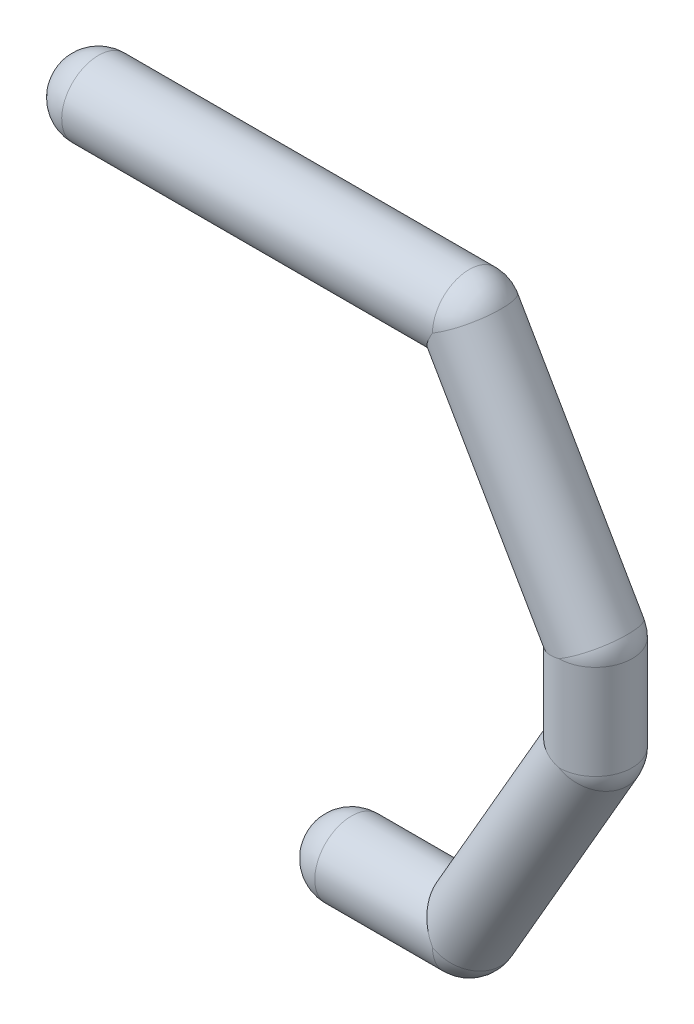
ISO-10303-21;
HEADER;
FILE_DESCRIPTION(('STEP AP214'),'2;1');
FILE_NAME('part.step','',(''),(''),'','','');
FILE_SCHEMA(('AUTOMOTIVE_DESIGN { 1 0 10303 214 1 1 1 1 }'));
ENDSEC;
DATA;
#1=APPLICATION_CONTEXT('core data for automotive mechanical design processes');
#2=APPLICATION_PROTOCOL_DEFINITION('international standard','automotive_design',2000,#1);
#3=PRODUCT_CONTEXT('',#1,'mechanical');
#4=PRODUCT('Part','Part','',(#3));
#5=PRODUCT_RELATED_PRODUCT_CATEGORY('part','',(#4));
#6=PRODUCT_DEFINITION_FORMATION('','',#4);
#7=PRODUCT_DEFINITION_CONTEXT('part definition',#1,'design');
#8=PRODUCT_DEFINITION('design','',#6,#7);
#9=PRODUCT_DEFINITION_SHAPE('','',#8);
#10=(LENGTH_UNIT() NAMED_UNIT(*) SI_UNIT(.MILLI.,.METRE.));
#11=(NAMED_UNIT(*) PLANE_ANGLE_UNIT() SI_UNIT($,.RADIAN.));
#12=(NAMED_UNIT(*) SI_UNIT($,.STERADIAN.) SOLID_ANGLE_UNIT());
#13=UNCERTAINTY_MEASURE_WITH_UNIT(LENGTH_MEASURE(1.E-05),#10,'distance_accuracy_value','');
#14=(GEOMETRIC_REPRESENTATION_CONTEXT(3) GLOBAL_UNCERTAINTY_ASSIGNED_CONTEXT((#13)) GLOBAL_UNIT_ASSIGNED_CONTEXT((#10,
#11,#12)) REPRESENTATION_CONTEXT('',''));
#15=CARTESIAN_POINT('',(0.,0.,0.));
#16=DIRECTION('',(0.,0.,1.));
#17=DIRECTION('',(1.,0.,0.));
#18=AXIS2_PLACEMENT_3D('',#15,#16,#17);
#19=CARTESIAN_POINT('',(20.396,-13.08,1.725));
#20=DIRECTION('',(1.,0.,0.));
#21=DIRECTION('',(0.,-1.,0.));
#22=AXIS2_PLACEMENT_3D('',#19,#20,#21);
#23=SPHERICAL_SURFACE('',#22,0.24);
#24=CARTESIAN_POINT('',(20.396,-13.08,1.725));
#25=DIRECTION('',(-1.,0.,0.));
#26=DIRECTION('',(0.,0.,1.));
#27=AXIS2_PLACEMENT_3D('',#24,#25,#26);
#28=CIRCLE('',#27,0.24);
#29=CARTESIAN_POINT('',(20.396,-13.08,1.965));
#30=VERTEX_POINT('',#29);
#31=EDGE_CURVE('E70',#30,#30,#28,.F.);
#32=ORIENTED_EDGE('',*,*,#31,.F.);
#33=EDGE_LOOP('',(#32));
#34=FACE_BOUND('',#33,.T.);
#35=ADVANCED_FACE('F63',(#34),#23,.T.);
#36=CARTESIAN_POINT('',(21.166,-13.08,1.725));
#37=DIRECTION('',(-1.,0.,0.));
#38=DIRECTION('',(0.,0.,1.));
#39=AXIS2_PLACEMENT_3D('',#36,#37,#38);
#40=CYLINDRICAL_SURFACE('',#39,0.24);
#41=CARTESIAN_POINT('',(21.166,-13.08,1.725));
#42=DIRECTION('',(-0.866000737383216,-0.50004272102664,0.));
#43=DIRECTION('',(-0.500042721026639,0.866000737383216,0.));
#44=AXIS2_PLACEMENT_3D('',#41,#42,#43);
#45=ELLIPSE('',#44,0.277136022684236,0.24);
#46=CARTESIAN_POINT('',(21.166,-13.08,1.485));
#47=VERTEX_POINT('',#46);
#48=CARTESIAN_POINT('',(21.166,-13.08,1.965));
#49=VERTEX_POINT('',#48);
#50=EDGE_CURVE('E12',#47,#49,#45,.F.);
#51=ORIENTED_EDGE('',*,*,#50,.F.);
#52=CARTESIAN_POINT('',(21.166,-13.08,1.725));
#53=DIRECTION('',(-1.,0.,0.));
#54=DIRECTION('',(0.,0.,1.));
#55=AXIS2_PLACEMENT_3D('',#52,#53,#54);
#56=CIRCLE('',#55,0.24);
#57=EDGE_CURVE('E77',#47,#49,#56,.T.);
#58=ORIENTED_EDGE('',*,*,#57,.T.);
#59=EDGE_LOOP('',(#51,#58));
#60=FACE_BOUND('',#59,.T.);
#61=ORIENTED_EDGE('',*,*,#31,.T.);
#62=EDGE_LOOP('',(#61));
#63=FACE_BOUND('',#62,.T.);
#64=ADVANCED_FACE('F137',(#60,#63),#40,.T.);
#65=CARTESIAN_POINT('',(21.166,-13.08,1.725));
#66=DIRECTION('',(1.,0.,0.));
#67=DIRECTION('',(0.,-1.,0.));
#68=AXIS2_PLACEMENT_3D('',#65,#66,#67);
#69=SPHERICAL_SURFACE('',#68,0.24);
#70=ORIENTED_EDGE('',*,*,#57,.F.);
#71=CARTESIAN_POINT('',(21.166,-13.08,1.725));
#72=DIRECTION('',(-0.499914554296549,-0.86607473026436,0.));
#73=DIRECTION('',(0.86607473026436,-0.499914554296549,0.));
#74=AXIS2_PLACEMENT_3D('',#71,#72,#73);
#75=CIRCLE('',#74,0.24);
#76=EDGE_CURVE('E128',#49,#47,#75,.F.);
#77=ORIENTED_EDGE('',*,*,#76,.F.);
#78=EDGE_LOOP('',(#70,#77));
#79=FACE_BOUND('',#78,.T.);
#80=ADVANCED_FACE('F143',(#79),#69,.T.);
#81=CARTESIAN_POINT('',(21.992,-11.649,1.725));
#82=DIRECTION('',(-0.499914554296549,-0.86607473026436,0.));
#83=DIRECTION('',(0.86607473026436,-0.499914554296549,0.));
#84=AXIS2_PLACEMENT_3D('',#81,#82,#83);
#85=CYLINDRICAL_SURFACE('',#84,0.24);
#86=CARTESIAN_POINT('',(21.992,-11.649,1.725));
#87=DIRECTION('',(-0.258771394995313,-0.965938592837132,0.));
#88=DIRECTION('',(-0.965938592837132,0.258771394995313,0.));
#89=AXIS2_PLACEMENT_3D('',#86,#87,#88);
#90=ELLIPSE('',#89,0.248462999387029,0.24);
#91=CARTESIAN_POINT('',(21.992,-11.649,1.485));
#92=VERTEX_POINT('',#91);
#93=CARTESIAN_POINT('',(21.992,-11.649,1.965));
#94=VERTEX_POINT('',#93);
#95=EDGE_CURVE('E131',#92,#94,#90,.F.);
#96=ORIENTED_EDGE('',*,*,#95,.F.);
#97=CARTESIAN_POINT('',(21.992,-11.649,1.725));
#98=DIRECTION('',(-0.499914554296552,-0.866074730264358,0.));
#99=DIRECTION('',(0.866074730264358,-0.499914554296552,0.));
#100=AXIS2_PLACEMENT_3D('',#97,#98,#99);
#101=CIRCLE('',#100,0.24);
#102=EDGE_CURVE('E126',#92,#94,#101,.T.);
#103=ORIENTED_EDGE('',*,*,#102,.T.);
#104=EDGE_LOOP('',(#96,#103));
#105=FACE_BOUND('',#104,.T.);
#106=ORIENTED_EDGE('',*,*,#76,.T.);
#107=ORIENTED_EDGE('',*,*,#50,.T.);
#108=EDGE_LOOP('',(#106,#107));
#109=FACE_BOUND('',#108,.T.);
#110=ADVANCED_FACE('F147',(#105,#109),#85,.T.);
#111=CARTESIAN_POINT('',(21.992,-11.649,1.725));
#112=DIRECTION('',(1.,0.,0.));
#113=DIRECTION('',(0.,-1.,0.));
#114=AXIS2_PLACEMENT_3D('',#111,#112,#113);
#115=SPHERICAL_SURFACE('',#114,0.24);
#116=ORIENTED_EDGE('',*,*,#102,.F.);
#117=CARTESIAN_POINT('',(21.992,-11.649,1.725));
#118=DIRECTION('',(0.,-1.,0.));
#119=DIRECTION('',(0.,0.,-1.));
#120=AXIS2_PLACEMENT_3D('',#117,#118,#119);
#121=CIRCLE('',#120,0.24);
#122=EDGE_CURVE('E116',#94,#92,#121,.F.);
#123=ORIENTED_EDGE('',*,*,#122,.F.);
#124=EDGE_LOOP('',(#116,#123));
#125=FACE_BOUND('',#124,.T.);
#126=ADVANCED_FACE('F153',(#125),#115,.T.);
#127=CARTESIAN_POINT('',(21.992,-11.031,1.725));
#128=DIRECTION('',(0.,-1.,0.));
#129=DIRECTION('',(0.,0.,-1.));
#130=AXIS2_PLACEMENT_3D('',#127,#128,#129);
#131=CYLINDRICAL_SURFACE('',#130,0.240000000000001);
#132=CARTESIAN_POINT('',(21.992,-11.031,1.725));
#133=DIRECTION('',(0.258771394995313,-0.965938592837133,0.));
#134=DIRECTION('',(-0.965938592837133,-0.258771394995312,0.));
#135=AXIS2_PLACEMENT_3D('',#132,#133,#134);
#136=ELLIPSE('',#135,0.248462999387029,0.24);
#137=CARTESIAN_POINT('',(21.992,-11.031,1.485));
#138=VERTEX_POINT('',#137);
#139=CARTESIAN_POINT('',(21.992,-11.031,1.965));
#140=VERTEX_POINT('',#139);
#141=EDGE_CURVE('E123',#138,#140,#136,.F.);
#142=ORIENTED_EDGE('',*,*,#141,.F.);
#143=CARTESIAN_POINT('',(21.992,-11.031,1.725));
#144=DIRECTION('',(0.,-1.,0.));
#145=DIRECTION('',(0.,0.,-1.));
#146=AXIS2_PLACEMENT_3D('',#143,#144,#145);
#147=CIRCLE('',#146,0.240000000000001);
#148=EDGE_CURVE('E114',#138,#140,#147,.T.);
#149=ORIENTED_EDGE('',*,*,#148,.T.);
#150=EDGE_LOOP('',(#142,#149));
#151=FACE_BOUND('',#150,.T.);
#152=ORIENTED_EDGE('',*,*,#122,.T.);
#153=ORIENTED_EDGE('',*,*,#95,.T.);
#154=EDGE_LOOP('',(#152,#153));
#155=FACE_BOUND('',#154,.T.);
#156=ADVANCED_FACE('F157',(#151,#155),#131,.T.);
#157=CARTESIAN_POINT('',(21.992,-11.031,1.725));
#158=DIRECTION('',(1.,0.,0.));
#159=DIRECTION('',(0.,-1.,0.));
#160=AXIS2_PLACEMENT_3D('',#157,#158,#159);
#161=SPHERICAL_SURFACE('',#160,0.24);
#162=ORIENTED_EDGE('',*,*,#148,.F.);
#163=CARTESIAN_POINT('',(21.992,-11.031,1.725));
#164=DIRECTION('',(0.499914554296548,-0.86607473026436,0.));
#165=DIRECTION('',(0.86607473026436,0.499914554296548,0.));
#166=AXIS2_PLACEMENT_3D('',#163,#164,#165);
#167=CIRCLE('',#166,0.24);
#168=EDGE_CURVE('E104',#140,#138,#167,.F.);
#169=ORIENTED_EDGE('',*,*,#168,.F.);
#170=EDGE_LOOP('',(#162,#169));
#171=FACE_BOUND('',#170,.T.);
#172=ADVANCED_FACE('F161',(#171),#161,.T.);
#173=CARTESIAN_POINT('',(21.166,-9.6,1.725));
#174=DIRECTION('',(0.499914554296548,-0.86607473026436,0.));
#175=DIRECTION('',(0.86607473026436,0.499914554296548,0.));
#176=AXIS2_PLACEMENT_3D('',#173,#174,#175);
#177=CYLINDRICAL_SURFACE('',#176,0.24);
#178=CARTESIAN_POINT('',(21.166,-9.6,1.725));
#179=DIRECTION('',(0.866000737383216,-0.50004272102664,0.));
#180=DIRECTION('',(-0.500042721026639,-0.866000737383216,0.));
#181=AXIS2_PLACEMENT_3D('',#178,#179,#180);
#182=ELLIPSE('',#181,0.277136022684236,0.24);
#183=CARTESIAN_POINT('',(21.166,-9.6,1.485));
#184=VERTEX_POINT('',#183);
#185=CARTESIAN_POINT('',(21.166,-9.6,1.965));
#186=VERTEX_POINT('',#185);
#187=EDGE_CURVE('E109',#184,#186,#182,.F.);
#188=ORIENTED_EDGE('',*,*,#187,.F.);
#189=CARTESIAN_POINT('',(21.166,-9.6,1.725));
#190=DIRECTION('',(0.499914554296551,-0.866074730264358,0.));
#191=DIRECTION('',(0.866074730264358,0.499914554296551,0.));
#192=AXIS2_PLACEMENT_3D('',#189,#190,#191);
#193=CIRCLE('',#192,0.24);
#194=EDGE_CURVE('E97',#184,#186,#193,.T.);
#195=ORIENTED_EDGE('',*,*,#194,.T.);
#196=EDGE_LOOP('',(#188,#195));
#197=FACE_BOUND('',#196,.T.);
#198=ORIENTED_EDGE('',*,*,#168,.T.);
#199=ORIENTED_EDGE('',*,*,#141,.T.);
#200=EDGE_LOOP('',(#198,#199));
#201=FACE_BOUND('',#200,.T.);
#202=ADVANCED_FACE('F112',(#197,#201),#177,.T.);
#203=CARTESIAN_POINT('',(21.166,-9.6,1.725));
#204=DIRECTION('',(1.,0.,0.));
#205=DIRECTION('',(0.,-1.,0.));
#206=AXIS2_PLACEMENT_3D('',#203,#204,#205);
#207=SPHERICAL_SURFACE('',#206,0.24);
#208=ORIENTED_EDGE('',*,*,#194,.F.);
#209=CARTESIAN_POINT('',(21.166,-9.6,1.725));
#210=DIRECTION('',(1.,0.,0.));
#211=DIRECTION('',(0.,0.,-1.));
#212=AXIS2_PLACEMENT_3D('',#209,#210,#211);
#213=CIRCLE('',#212,0.24);
#214=EDGE_CURVE('E100',#184,#186,#213,.T.);
#215=ORIENTED_EDGE('',*,*,#214,.T.);
#216=EDGE_LOOP('',(#208,#215));
#217=FACE_BOUND('',#216,.T.);
#218=ADVANCED_FACE('F99',(#217),#207,.T.);
#219=CARTESIAN_POINT('',(18.741,-9.6,1.725));
#220=DIRECTION('',(1.,0.,0.));
#221=DIRECTION('',(0.,0.,-1.));
#222=AXIS2_PLACEMENT_3D('',#219,#220,#221);
#223=CYLINDRICAL_SURFACE('',#222,0.24);
#224=ORIENTED_EDGE('',*,*,#214,.F.);
#225=ORIENTED_EDGE('',*,*,#187,.T.);
#226=EDGE_LOOP('',(#224,#225));
#227=FACE_BOUND('',#226,.T.);
#228=CARTESIAN_POINT('',(18.741,-9.6,1.725));
#229=DIRECTION('',(1.,0.,0.));
#230=DIRECTION('',(0.,0.,-1.));
#231=AXIS2_PLACEMENT_3D('',#228,#229,#230);
#232=CIRCLE('',#231,0.24);
#233=CARTESIAN_POINT('',(18.741,-9.6,1.485));
#234=VERTEX_POINT('',#233);
#235=EDGE_CURVE('E110',#234,#234,#232,.T.);
#236=ORIENTED_EDGE('',*,*,#235,.T.);
#237=EDGE_LOOP('',(#236));
#238=FACE_BOUND('',#237,.T.);
#239=ADVANCED_FACE('F107',(#227,#238),#223,.T.);
#240=CARTESIAN_POINT('',(18.741,-9.6,1.725));
#241=DIRECTION('',(1.,0.,0.));
#242=DIRECTION('',(0.,-1.,0.));
#243=AXIS2_PLACEMENT_3D('',#240,#241,#242);
#244=SPHERICAL_SURFACE('',#243,0.24);
#245=ORIENTED_EDGE('',*,*,#235,.F.);
#246=EDGE_LOOP('',(#245));
#247=FACE_BOUND('',#246,.T.);
#248=ADVANCED_FACE('F168',(#247),#244,.T.);
#249=CLOSED_SHELL('',(#35,#64,#80,#110,#126,#156,#172,#202,#218,#239,#248));
#250=MANIFOLD_SOLID_BREP('B2',#249);
#251=ADVANCED_BREP_SHAPE_REPRESENTATION('',(#18,#250),#14);
#252=SHAPE_DEFINITION_REPRESENTATION(#9,#251);
ENDSEC;
END-ISO-10303-21;
